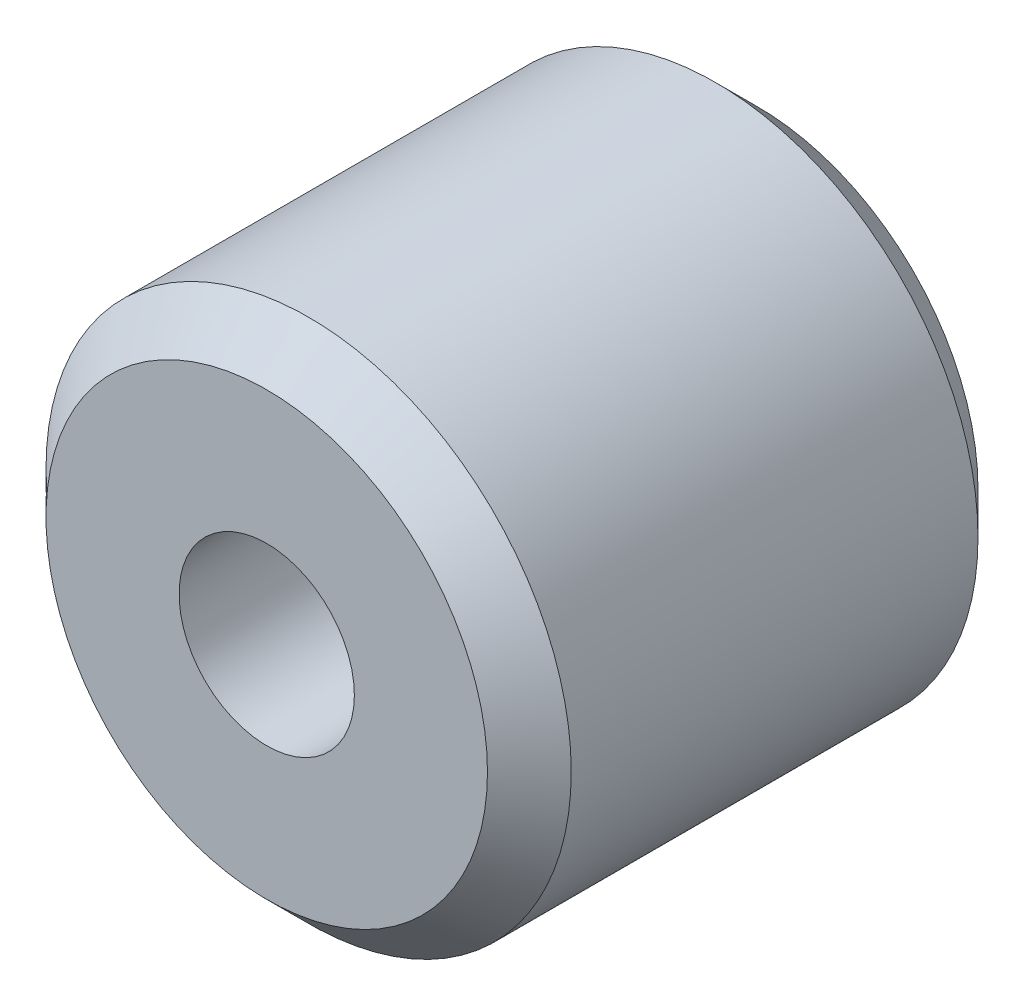
ISO-10303-21;
HEADER;
FILE_DESCRIPTION(('STEP AP214'),'2;1');
FILE_NAME('part.step','',(''),(''),'','','');
FILE_SCHEMA(('AUTOMOTIVE_DESIGN { 1 0 10303 214 1 1 1 1 }'));
ENDSEC;
DATA;
#1=APPLICATION_CONTEXT('core data for automotive mechanical design processes');
#2=APPLICATION_PROTOCOL_DEFINITION('international standard','automotive_design',2000,#1);
#3=PRODUCT_CONTEXT('',#1,'mechanical');
#4=PRODUCT('Part','Part','',(#3));
#5=PRODUCT_RELATED_PRODUCT_CATEGORY('part','',(#4));
#6=PRODUCT_DEFINITION_FORMATION('','',#4);
#7=PRODUCT_DEFINITION_CONTEXT('part definition',#1,'design');
#8=PRODUCT_DEFINITION('design','',#6,#7);
#9=PRODUCT_DEFINITION_SHAPE('','',#8);
#10=(LENGTH_UNIT() NAMED_UNIT(*) SI_UNIT(.MILLI.,.METRE.));
#11=(NAMED_UNIT(*) PLANE_ANGLE_UNIT() SI_UNIT($,.RADIAN.));
#12=(NAMED_UNIT(*) SI_UNIT($,.STERADIAN.) SOLID_ANGLE_UNIT());
#13=UNCERTAINTY_MEASURE_WITH_UNIT(LENGTH_MEASURE(1.E-05),#10,'distance_accuracy_value','');
#14=(GEOMETRIC_REPRESENTATION_CONTEXT(3) GLOBAL_UNCERTAINTY_ASSIGNED_CONTEXT((#13)) GLOBAL_UNIT_ASSIGNED_CONTEXT((#10,
#11,#12)) REPRESENTATION_CONTEXT('',''));
#15=CARTESIAN_POINT('',(0.,0.,0.));
#16=DIRECTION('',(0.,0.,1.));
#17=DIRECTION('',(1.,0.,0.));
#18=AXIS2_PLACEMENT_3D('',#15,#16,#17);
#19=CARTESIAN_POINT('',(0.,0.,4.45));
#20=DIRECTION('',(0.,0.,1.));
#21=DIRECTION('',(1.,0.,0.));
#22=AXIS2_PLACEMENT_3D('',#19,#20,#21);
#23=PLANE('',#22);
#24=CARTESIAN_POINT('',(0.,0.,4.45));
#25=DIRECTION('',(0.,0.,1.));
#26=DIRECTION('',(1.,0.,0.));
#27=AXIS2_PLACEMENT_3D('',#24,#25,#26);
#28=CIRCLE('',#27,4.005);
#29=CARTESIAN_POINT('',(4.005,0.,4.45));
#30=VERTEX_POINT('',#29);
#31=EDGE_CURVE('E10',#30,#30,#28,.T.);
#32=ORIENTED_EDGE('',*,*,#31,.T.);
#33=EDGE_LOOP('',(#32));
#34=FACE_BOUND('',#33,.T.);
#35=CARTESIAN_POINT('',(0.,0.,4.45));
#36=DIRECTION('',(0.,0.,1.));
#37=DIRECTION('',(1.,0.,0.));
#38=AXIS2_PLACEMENT_3D('',#35,#36,#37);
#39=CIRCLE('',#38,1.59);
#40=CARTESIAN_POINT('',(1.59,0.,4.45));
#41=VERTEX_POINT('',#40);
#42=EDGE_CURVE('E53',#41,#41,#39,.T.);
#43=ORIENTED_EDGE('',*,*,#42,.F.);
#44=EDGE_LOOP('',(#43));
#45=FACE_BOUND('',#44,.T.);
#46=ADVANCED_FACE('F32',(#34,#45),#23,.T.);
#47=CARTESIAN_POINT('',(0.,0.,-4.45));
#48=DIRECTION('',(0.,0.,1.));
#49=DIRECTION('',(1.,0.,0.));
#50=AXIS2_PLACEMENT_3D('',#47,#48,#49);
#51=PLANE('',#50);
#52=CARTESIAN_POINT('',(0.,0.,-4.45));
#53=DIRECTION('',(0.,0.,1.));
#54=DIRECTION('',(1.,0.,0.));
#55=AXIS2_PLACEMENT_3D('',#52,#53,#54);
#56=CIRCLE('',#55,4.00499999999999);
#57=CARTESIAN_POINT('',(4.00499999999999,0.,-4.45));
#58=VERTEX_POINT('',#57);
#59=EDGE_CURVE('E40',#58,#58,#56,.F.);
#60=ORIENTED_EDGE('',*,*,#59,.T.);
#61=EDGE_LOOP('',(#60));
#62=FACE_BOUND('',#61,.T.);
#63=CARTESIAN_POINT('',(0.,0.,-4.45));
#64=DIRECTION('',(0.,0.,1.));
#65=DIRECTION('',(1.,0.,0.));
#66=AXIS2_PLACEMENT_3D('',#63,#64,#65);
#67=CIRCLE('',#66,1.59);
#68=CARTESIAN_POINT('',(1.59,0.,-4.45));
#69=VERTEX_POINT('',#68);
#70=EDGE_CURVE('E54',#69,#69,#67,.T.);
#71=ORIENTED_EDGE('',*,*,#70,.T.);
#72=EDGE_LOOP('',(#71));
#73=FACE_BOUND('',#72,.T.);
#74=ADVANCED_FACE('F64',(#62,#73),#51,.F.);
#75=CARTESIAN_POINT('',(0.,0.,4.45));
#76=DIRECTION('',(0.,0.,-1.));
#77=DIRECTION('',(-1.,0.,0.));
#78=AXIS2_PLACEMENT_3D('',#75,#76,#77);
#79=CYLINDRICAL_SURFACE('',#78,4.765);
#80=CARTESIAN_POINT('',(0.,0.,-3.69));
#81=DIRECTION('',(0.,0.,1.));
#82=DIRECTION('',(1.,0.,0.));
#83=AXIS2_PLACEMENT_3D('',#80,#81,#82);
#84=CIRCLE('',#83,4.765);
#85=CARTESIAN_POINT('',(4.765,0.,-3.69));
#86=VERTEX_POINT('',#85);
#87=EDGE_CURVE('E44',#86,#86,#84,.T.);
#88=ORIENTED_EDGE('',*,*,#87,.T.);
#89=EDGE_LOOP('',(#88));
#90=FACE_BOUND('',#89,.T.);
#91=CARTESIAN_POINT('',(0.,0.,3.69));
#92=DIRECTION('',(0.,0.,1.));
#93=DIRECTION('',(1.,0.,0.));
#94=AXIS2_PLACEMENT_3D('',#91,#92,#93);
#95=CIRCLE('',#94,4.765);
#96=CARTESIAN_POINT('',(4.765,0.,3.69));
#97=VERTEX_POINT('',#96);
#98=EDGE_CURVE('E48',#97,#97,#95,.F.);
#99=ORIENTED_EDGE('',*,*,#98,.T.);
#100=EDGE_LOOP('',(#99));
#101=FACE_BOUND('',#100,.T.);
#102=ADVANCED_FACE('F69',(#90,#101),#79,.T.);
#103=CARTESIAN_POINT('',(0.,0.,4.45));
#104=DIRECTION('',(0.,0.,-1.));
#105=DIRECTION('',(-1.,0.,0.));
#106=AXIS2_PLACEMENT_3D('',#103,#104,#105);
#107=CYLINDRICAL_SURFACE('',#106,1.59);
#108=ORIENTED_EDGE('',*,*,#42,.T.);
#109=EDGE_LOOP('',(#108));
#110=FACE_BOUND('',#109,.T.);
#111=ORIENTED_EDGE('',*,*,#70,.F.);
#112=EDGE_LOOP('',(#111));
#113=FACE_BOUND('',#112,.T.);
#114=ADVANCED_FACE('F60',(#110,#113),#107,.F.);
#115=CARTESIAN_POINT('',(0.,0.,-3.69));
#116=DIRECTION('',(0.,0.,1.));
#117=DIRECTION('',(1.,0.,0.));
#118=AXIS2_PLACEMENT_3D('',#115,#116,#117);
#119=CONICAL_SURFACE('',#118,4.765,0.78539816339745);
#120=ORIENTED_EDGE('',*,*,#59,.F.);
#121=EDGE_LOOP('',(#120));
#122=FACE_BOUND('',#121,.T.);
#123=ORIENTED_EDGE('',*,*,#87,.F.);
#124=EDGE_LOOP('',(#123));
#125=FACE_BOUND('',#124,.T.);
#126=ADVANCED_FACE('F76',(#122,#125),#119,.T.);
#127=CARTESIAN_POINT('',(0.,0.,4.45));
#128=DIRECTION('',(0.,0.,-1.));
#129=DIRECTION('',(-1.,0.,0.));
#130=AXIS2_PLACEMENT_3D('',#127,#128,#129);
#131=CONICAL_SURFACE('',#130,4.005,0.785398163397447);
#132=ORIENTED_EDGE('',*,*,#98,.F.);
#133=EDGE_LOOP('',(#132));
#134=FACE_BOUND('',#133,.T.);
#135=ORIENTED_EDGE('',*,*,#31,.F.);
#136=EDGE_LOOP('',(#135));
#137=FACE_BOUND('',#136,.T.);
#138=ADVANCED_FACE('F35',(#134,#137),#131,.T.);
#139=CLOSED_SHELL('',(#46,#74,#102,#114,#126,#138));
#140=MANIFOLD_SOLID_BREP('B2',#139);
#141=ADVANCED_BREP_SHAPE_REPRESENTATION('',(#18,#140),#14);
#142=SHAPE_DEFINITION_REPRESENTATION(#9,#141);
ENDSEC;
END-ISO-10303-21;
